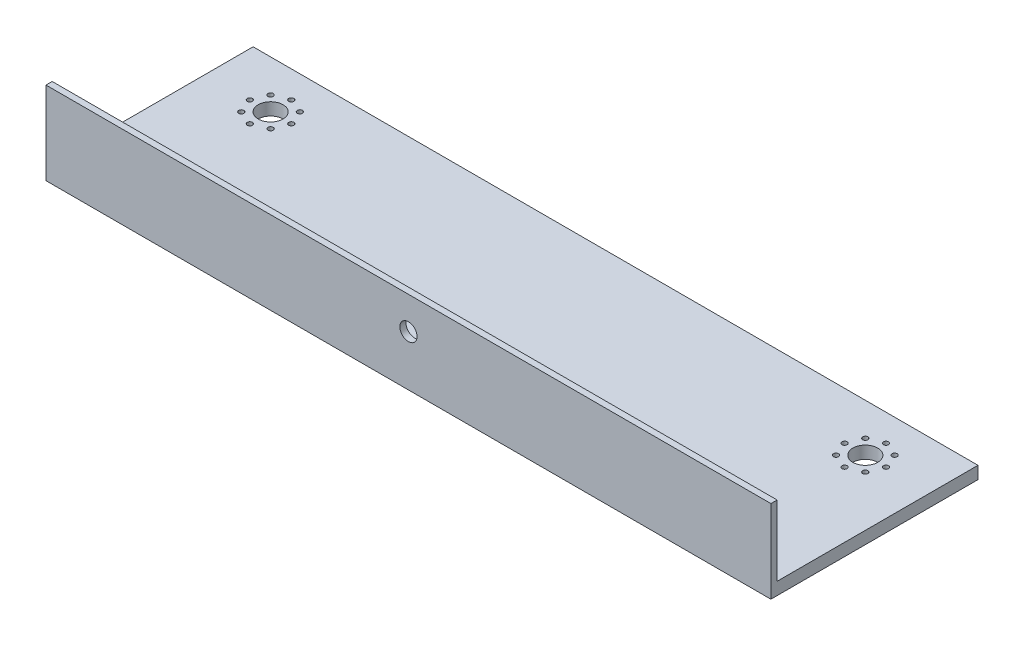
ISO-10303-21;
HEADER;
FILE_DESCRIPTION(('STEP AP214'),'2;1');
FILE_NAME('part.step','',(''),(''),'','','');
FILE_SCHEMA(('AUTOMOTIVE_DESIGN { 1 0 10303 214 1 1 1 1 }'));
ENDSEC;
DATA;
#1=APPLICATION_CONTEXT('core data for automotive mechanical design processes');
#2=APPLICATION_PROTOCOL_DEFINITION('international standard','automotive_design',2000,#1);
#3=PRODUCT_CONTEXT('',#1,'mechanical');
#4=PRODUCT('Part','Part','',(#3));
#5=PRODUCT_RELATED_PRODUCT_CATEGORY('part','',(#4));
#6=PRODUCT_DEFINITION_FORMATION('','',#4);
#7=PRODUCT_DEFINITION_CONTEXT('part definition',#1,'design');
#8=PRODUCT_DEFINITION('design','',#6,#7);
#9=PRODUCT_DEFINITION_SHAPE('','',#8);
#10=(LENGTH_UNIT() NAMED_UNIT(*) SI_UNIT(.MILLI.,.METRE.));
#11=(NAMED_UNIT(*) PLANE_ANGLE_UNIT() SI_UNIT($,.RADIAN.));
#12=(NAMED_UNIT(*) SI_UNIT($,.STERADIAN.) SOLID_ANGLE_UNIT());
#13=UNCERTAINTY_MEASURE_WITH_UNIT(LENGTH_MEASURE(1.E-05),#10,'distance_accuracy_value','');
#14=(GEOMETRIC_REPRESENTATION_CONTEXT(3) GLOBAL_UNCERTAINTY_ASSIGNED_CONTEXT((#13)) GLOBAL_UNIT_ASSIGNED_CONTEXT((#10,
#11,#12)) REPRESENTATION_CONTEXT('',''));
#15=CARTESIAN_POINT('',(0.,0.,0.));
#16=DIRECTION('',(0.,0.,1.));
#17=DIRECTION('',(1.,0.,0.));
#18=AXIS2_PLACEMENT_3D('',#15,#16,#17);
#19=CARTESIAN_POINT('',(0.,3.,0.));
#20=DIRECTION('',(0.,-1.,0.));
#21=DIRECTION('',(0.,0.,-1.));
#22=AXIS2_PLACEMENT_3D('',#19,#20,#21);
#23=PLANE('',#22);
#24=CARTESIAN_POINT('',(-143.57,3.,-37.0150274299857));
#25=DIRECTION('',(0.,-1.,0.));
#26=DIRECTION('',(0.,0.,1.));
#27=AXIS2_PLACEMENT_3D('',#24,#25,#26);
#28=CIRCLE('',#27,1.25000000000001);
#29=CARTESIAN_POINT('',(-143.57,3.,-35.7650274299857));
#30=VERTEX_POINT('',#29);
#31=EDGE_CURVE('E523',#30,#30,#28,.T.);
#32=ORIENTED_EDGE('',*,*,#31,.T.);
#33=EDGE_LOOP('',(#32));
#34=FACE_BOUND('',#33,.T.);
#35=CARTESIAN_POINT('',(-136.498932188135,3.,-19.9439596181202));
#36=DIRECTION('',(0.,-1.,0.));
#37=DIRECTION('',(0.,0.,-1.));
#38=AXIS2_PLACEMENT_3D('',#35,#36,#37);
#39=CIRCLE('',#38,1.25000000000001);
#40=CARTESIAN_POINT('',(-136.498932188135,3.,-21.1939596181202));
#41=VERTEX_POINT('',#40);
#42=EDGE_CURVE('E524',#41,#41,#39,.T.);
#43=ORIENTED_EDGE('',*,*,#42,.T.);
#44=EDGE_LOOP('',(#43));
#45=FACE_BOUND('',#44,.T.);
#46=CARTESIAN_POINT('',(-150.641067811865,3.,-19.9439596181202));
#47=DIRECTION('',(0.,-1.,0.));
#48=DIRECTION('',(0.,0.,1.));
#49=AXIS2_PLACEMENT_3D('',#46,#47,#48);
#50=CIRCLE('',#49,1.25000000000001);
#51=CARTESIAN_POINT('',(-150.641067811865,3.,-18.6939596181202));
#52=VERTEX_POINT('',#51);
#53=EDGE_CURVE('E530',#52,#52,#50,.T.);
#54=ORIENTED_EDGE('',*,*,#53,.T.);
#55=EDGE_LOOP('',(#54));
#56=FACE_BOUND('',#55,.T.);
#57=CARTESIAN_POINT('',(-150.641067811865,3.,-34.0860952418512));
#58=DIRECTION('',(0.,-1.,0.));
#59=DIRECTION('',(0.,0.,-1.));
#60=AXIS2_PLACEMENT_3D('',#57,#58,#59);
#61=CIRCLE('',#60,1.25000000000001);
#62=CARTESIAN_POINT('',(-150.641067811865,3.,-35.3360952418512));
#63=VERTEX_POINT('',#62);
#64=EDGE_CURVE('E536',#63,#63,#61,.T.);
#65=ORIENTED_EDGE('',*,*,#64,.T.);
#66=EDGE_LOOP('',(#65));
#67=FACE_BOUND('',#66,.T.);
#68=CARTESIAN_POINT('',(-136.498932188135,3.,-34.0860952418512));
#69=DIRECTION('',(0.,-1.,0.));
#70=DIRECTION('',(0.,0.,1.));
#71=AXIS2_PLACEMENT_3D('',#68,#69,#70);
#72=CIRCLE('',#71,1.25000000000001);
#73=CARTESIAN_POINT('',(-136.498932188135,3.,-32.8360952418512));
#74=VERTEX_POINT('',#73);
#75=EDGE_CURVE('E498',#74,#74,#72,.T.);
#76=ORIENTED_EDGE('',*,*,#75,.T.);
#77=EDGE_LOOP('',(#76));
#78=FACE_BOUND('',#77,.T.);
#79=CARTESIAN_POINT('',(-133.57,3.,-27.0150274299857));
#80=DIRECTION('',(0.,-1.,0.));
#81=DIRECTION('',(0.,0.,1.));
#82=AXIS2_PLACEMENT_3D('',#79,#80,#81);
#83=CIRCLE('',#82,1.25000000000001);
#84=CARTESIAN_POINT('',(-133.57,3.,-25.7650274299857));
#85=VERTEX_POINT('',#84);
#86=EDGE_CURVE('E505',#85,#85,#83,.T.);
#87=ORIENTED_EDGE('',*,*,#86,.T.);
#88=EDGE_LOOP('',(#87));
#89=FACE_BOUND('',#88,.T.);
#90=CARTESIAN_POINT('',(-143.57,3.,-17.0150274299857));
#91=DIRECTION('',(0.,-1.,0.));
#92=DIRECTION('',(0.,0.,1.));
#93=AXIS2_PLACEMENT_3D('',#90,#91,#92);
#94=CIRCLE('',#93,1.25000000000001);
#95=CARTESIAN_POINT('',(-143.57,3.,-15.7650274299857));
#96=VERTEX_POINT('',#95);
#97=EDGE_CURVE('E511',#96,#96,#94,.T.);
#98=ORIENTED_EDGE('',*,*,#97,.T.);
#99=EDGE_LOOP('',(#98));
#100=FACE_BOUND('',#99,.T.);
#101=CARTESIAN_POINT('',(-153.57,3.,-27.0150274299857));
#102=DIRECTION('',(0.,-1.,0.));
#103=DIRECTION('',(0.,0.,1.));
#104=AXIS2_PLACEMENT_3D('',#101,#102,#103);
#105=CIRCLE('',#104,1.25000000000001);
#106=CARTESIAN_POINT('',(-153.57,3.,-25.7650274299857));
#107=VERTEX_POINT('',#106);
#108=EDGE_CURVE('E517',#107,#107,#105,.T.);
#109=ORIENTED_EDGE('',*,*,#108,.T.);
#110=EDGE_LOOP('',(#109));
#111=FACE_BOUND('',#110,.T.);
#112=CARTESIAN_POINT('',(143.57,3.,-37.0150274299857));
#113=DIRECTION('',(0.,1.,0.));
#114=DIRECTION('',(0.,0.,1.));
#115=AXIS2_PLACEMENT_3D('',#112,#113,#114);
#116=CIRCLE('',#115,1.25000000000001);
#117=CARTESIAN_POINT('',(143.57,3.,-35.7650274299857));
#118=VERTEX_POINT('',#117);
#119=EDGE_CURVE('E450',#118,#118,#116,.T.);
#120=ORIENTED_EDGE('',*,*,#119,.F.);
#121=EDGE_LOOP('',(#120));
#122=FACE_BOUND('',#121,.T.);
#123=CARTESIAN_POINT('',(136.498932188135,3.,-19.9439596181202));
#124=DIRECTION('',(0.,1.,0.));
#125=DIRECTION('',(0.,0.,-1.));
#126=AXIS2_PLACEMENT_3D('',#123,#124,#125);
#127=CIRCLE('',#126,1.25000000000001);
#128=CARTESIAN_POINT('',(136.498932188135,3.,-21.1939596181202));
#129=VERTEX_POINT('',#128);
#130=EDGE_CURVE('E478',#129,#129,#127,.T.);
#131=ORIENTED_EDGE('',*,*,#130,.F.);
#132=EDGE_LOOP('',(#131));
#133=FACE_BOUND('',#132,.T.);
#134=CARTESIAN_POINT('',(150.641067811865,3.,-19.9439596181202));
#135=DIRECTION('',(0.,1.,0.));
#136=DIRECTION('',(0.,0.,1.));
#137=AXIS2_PLACEMENT_3D('',#134,#135,#136);
#138=CIRCLE('',#137,1.25000000000001);
#139=CARTESIAN_POINT('',(150.641067811865,3.,-18.6939596181202));
#140=VERTEX_POINT('',#139);
#141=EDGE_CURVE('E485',#140,#140,#138,.T.);
#142=ORIENTED_EDGE('',*,*,#141,.F.);
#143=EDGE_LOOP('',(#142));
#144=FACE_BOUND('',#143,.T.);
#145=CARTESIAN_POINT('',(150.641067811865,3.,-34.0860952418512));
#146=DIRECTION('',(0.,1.,0.));
#147=DIRECTION('',(0.,0.,-1.));
#148=AXIS2_PLACEMENT_3D('',#145,#146,#147);
#149=CIRCLE('',#148,1.25000000000001);
#150=CARTESIAN_POINT('',(150.641067811865,3.,-35.3360952418512));
#151=VERTEX_POINT('',#150);
#152=EDGE_CURVE('E491',#151,#151,#149,.T.);
#153=ORIENTED_EDGE('',*,*,#152,.F.);
#154=EDGE_LOOP('',(#153));
#155=FACE_BOUND('',#154,.T.);
#156=CARTESIAN_POINT('',(136.498932188135,3.,-34.0860952418512));
#157=DIRECTION('',(0.,1.,0.));
#158=DIRECTION('',(0.,0.,1.));
#159=AXIS2_PLACEMENT_3D('',#156,#157,#158);
#160=CIRCLE('',#159,1.25000000000001);
#161=CARTESIAN_POINT('',(136.498932188135,3.,-32.8360952418512));
#162=VERTEX_POINT('',#161);
#163=EDGE_CURVE('E453',#162,#162,#160,.T.);
#164=ORIENTED_EDGE('',*,*,#163,.F.);
#165=EDGE_LOOP('',(#164));
#166=FACE_BOUND('',#165,.T.);
#167=CARTESIAN_POINT('',(133.57,3.,-27.0150274299857));
#168=DIRECTION('',(0.,1.,0.));
#169=DIRECTION('',(0.,0.,1.));
#170=AXIS2_PLACEMENT_3D('',#167,#168,#169);
#171=CIRCLE('',#170,1.25000000000001);
#172=CARTESIAN_POINT('',(133.57,3.,-25.7650274299857));
#173=VERTEX_POINT('',#172);
#174=EDGE_CURVE('E460',#173,#173,#171,.T.);
#175=ORIENTED_EDGE('',*,*,#174,.F.);
#176=EDGE_LOOP('',(#175));
#177=FACE_BOUND('',#176,.T.);
#178=CARTESIAN_POINT('',(143.57,3.,-17.0150274299857));
#179=DIRECTION('',(0.,1.,0.));
#180=DIRECTION('',(0.,0.,1.));
#181=AXIS2_PLACEMENT_3D('',#178,#179,#180);
#182=CIRCLE('',#181,1.25000000000001);
#183=CARTESIAN_POINT('',(143.57,3.,-15.7650274299857));
#184=VERTEX_POINT('',#183);
#185=EDGE_CURVE('E466',#184,#184,#182,.T.);
#186=ORIENTED_EDGE('',*,*,#185,.F.);
#187=EDGE_LOOP('',(#186));
#188=FACE_BOUND('',#187,.T.);
#189=CARTESIAN_POINT('',(153.57,3.,-27.0150274299857));
#190=DIRECTION('',(0.,1.,0.));
#191=DIRECTION('',(0.,0.,1.));
#192=AXIS2_PLACEMENT_3D('',#189,#190,#191);
#193=CIRCLE('',#192,1.25000000000001);
#194=CARTESIAN_POINT('',(153.57,3.,-25.7650274299857));
#195=VERTEX_POINT('',#194);
#196=EDGE_CURVE('E472',#195,#195,#193,.T.);
#197=ORIENTED_EDGE('',*,*,#196,.F.);
#198=EDGE_LOOP('',(#197));
#199=FACE_BOUND('',#198,.T.);
#200=CARTESIAN_POINT('',(-143.57,3.,-27.0150274299857));
#201=DIRECTION('',(0.,1.,0.));
#202=DIRECTION('',(0.,0.,1.));
#203=AXIS2_PLACEMENT_3D('',#200,#201,#202);
#204=CIRCLE('',#203,6.00000000000002);
#205=CARTESIAN_POINT('',(-143.57,3.,-21.0150274299857));
#206=VERTEX_POINT('',#205);
#207=EDGE_CURVE('E120',#206,#206,#204,.T.);
#208=ORIENTED_EDGE('',*,*,#207,.F.);
#209=EDGE_LOOP('',(#208));
#210=FACE_BOUND('',#209,.T.);
#211=CARTESIAN_POINT('',(143.57,3.,-27.0150274299857));
#212=DIRECTION('',(0.,1.,0.));
#213=DIRECTION('',(0.,0.,1.));
#214=AXIS2_PLACEMENT_3D('',#211,#212,#213);
#215=CIRCLE('',#214,6.00000000000002);
#216=CARTESIAN_POINT('',(143.57,3.,-21.0150274299857));
#217=VERTEX_POINT('',#216);
#218=EDGE_CURVE('E126',#217,#217,#215,.T.);
#219=ORIENTED_EDGE('',*,*,#218,.F.);
#220=EDGE_LOOP('',(#219));
#221=FACE_BOUND('',#220,.T.);
#222=DIRECTION('',(-1.,0.,0.));
#223=VECTOR('',#222,1.);
#224=CARTESIAN_POINT('',(0.,3.,47.));
#225=LINE('',#224,#223);
#226=CARTESIAN_POINT('',(175.,3.,47.));
#227=VERTEX_POINT('',#226);
#228=CARTESIAN_POINT('',(-175.,3.,47.));
#229=VERTEX_POINT('',#228);
#230=EDGE_CURVE('E53',#227,#229,#225,.T.);
#231=ORIENTED_EDGE('',*,*,#230,.F.);
#232=DIRECTION('',(0.,0.,-1.));
#233=VECTOR('',#232,1.);
#234=CARTESIAN_POINT('',(175.,3.,50.));
#235=LINE('',#234,#233);
#236=CARTESIAN_POINT('',(175.,3.,-50.));
#237=VERTEX_POINT('',#236);
#238=EDGE_CURVE('E95',#227,#237,#235,.T.);
#239=ORIENTED_EDGE('',*,*,#238,.T.);
#240=DIRECTION('',(-1.,0.,0.));
#241=VECTOR('',#240,1.);
#242=CARTESIAN_POINT('',(-175.,3.,-50.));
#243=LINE('',#242,#241);
#244=CARTESIAN_POINT('',(-175.,3.,-50.));
#245=VERTEX_POINT('',#244);
#246=EDGE_CURVE('E133',#237,#245,#243,.T.);
#247=ORIENTED_EDGE('',*,*,#246,.T.);
#248=DIRECTION('',(0.,0.,1.));
#249=VECTOR('',#248,1.);
#250=CARTESIAN_POINT('',(-175.,3.,50.));
#251=LINE('',#250,#249);
#252=EDGE_CURVE('E58',#245,#229,#251,.T.);
#253=ORIENTED_EDGE('',*,*,#252,.T.);
#254=EDGE_LOOP('',(#231,#239,#247,#253));
#255=FACE_BOUND('',#254,.T.);
#256=ADVANCED_FACE('F37',(#34,#45,#56,#67,#78,#89,#100,#111,#122,#133,#144,#155,#166,#177,#188,
#199,#210,#221,#255),#23,.F.);
#257=CARTESIAN_POINT('',(0.,-3.,0.));
#258=DIRECTION('',(0.,-1.,0.));
#259=DIRECTION('',(0.,0.,-1.));
#260=AXIS2_PLACEMENT_3D('',#257,#258,#259);
#261=PLANE('',#260);
#262=CARTESIAN_POINT('',(-143.57,-3.,-37.0150274299857));
#263=DIRECTION('',(0.,-1.,0.));
#264=DIRECTION('',(0.,0.,1.));
#265=AXIS2_PLACEMENT_3D('',#262,#263,#264);
#266=CIRCLE('',#265,1.25000000000001);
#267=CARTESIAN_POINT('',(-143.57,-3.,-35.7650274299857));
#268=VERTEX_POINT('',#267);
#269=EDGE_CURVE('E482',#268,#268,#266,.T.);
#270=ORIENTED_EDGE('',*,*,#269,.F.);
#271=EDGE_LOOP('',(#270));
#272=FACE_BOUND('',#271,.T.);
#273=CARTESIAN_POINT('',(-136.498932188135,-3.,-19.9439596181202));
#274=DIRECTION('',(0.,-1.,0.));
#275=DIRECTION('',(0.,0.,-1.));
#276=AXIS2_PLACEMENT_3D('',#273,#274,#275);
#277=CIRCLE('',#276,1.25000000000001);
#278=CARTESIAN_POINT('',(-136.498932188135,-3.,-21.1939596181202));
#279=VERTEX_POINT('',#278);
#280=EDGE_CURVE('E527',#279,#279,#277,.T.);
#281=ORIENTED_EDGE('',*,*,#280,.F.);
#282=EDGE_LOOP('',(#281));
#283=FACE_BOUND('',#282,.T.);
#284=CARTESIAN_POINT('',(-150.641067811865,-3.,-19.9439596181202));
#285=DIRECTION('',(0.,-1.,0.));
#286=DIRECTION('',(0.,0.,1.));
#287=AXIS2_PLACEMENT_3D('',#284,#285,#286);
#288=CIRCLE('',#287,1.25000000000001);
#289=CARTESIAN_POINT('',(-150.641067811865,-3.,-18.6939596181202));
#290=VERTEX_POINT('',#289);
#291=EDGE_CURVE('E533',#290,#290,#288,.T.);
#292=ORIENTED_EDGE('',*,*,#291,.F.);
#293=EDGE_LOOP('',(#292));
#294=FACE_BOUND('',#293,.T.);
#295=CARTESIAN_POINT('',(-150.641067811865,-3.,-34.0860952418512));
#296=DIRECTION('',(0.,-1.,0.));
#297=DIRECTION('',(0.,0.,-1.));
#298=AXIS2_PLACEMENT_3D('',#295,#296,#297);
#299=CIRCLE('',#298,1.25000000000001);
#300=CARTESIAN_POINT('',(-150.641067811865,-3.,-35.3360952418512));
#301=VERTEX_POINT('',#300);
#302=EDGE_CURVE('E502',#301,#301,#299,.T.);
#303=ORIENTED_EDGE('',*,*,#302,.F.);
#304=EDGE_LOOP('',(#303));
#305=FACE_BOUND('',#304,.T.);
#306=CARTESIAN_POINT('',(-136.498932188135,-3.,-34.0860952418512));
#307=DIRECTION('',(0.,-1.,0.));
#308=DIRECTION('',(0.,0.,1.));
#309=AXIS2_PLACEMENT_3D('',#306,#307,#308);
#310=CIRCLE('',#309,1.25000000000001);
#311=CARTESIAN_POINT('',(-136.498932188135,-3.,-32.8360952418512));
#312=VERTEX_POINT('',#311);
#313=EDGE_CURVE('E501',#312,#312,#310,.T.);
#314=ORIENTED_EDGE('',*,*,#313,.F.);
#315=EDGE_LOOP('',(#314));
#316=FACE_BOUND('',#315,.T.);
#317=CARTESIAN_POINT('',(-133.57,-3.,-27.0150274299857));
#318=DIRECTION('',(0.,-1.,0.));
#319=DIRECTION('',(0.,0.,1.));
#320=AXIS2_PLACEMENT_3D('',#317,#318,#319);
#321=CIRCLE('',#320,1.25000000000001);
#322=CARTESIAN_POINT('',(-133.57,-3.,-25.7650274299857));
#323=VERTEX_POINT('',#322);
#324=EDGE_CURVE('E508',#323,#323,#321,.T.);
#325=ORIENTED_EDGE('',*,*,#324,.F.);
#326=EDGE_LOOP('',(#325));
#327=FACE_BOUND('',#326,.T.);
#328=CARTESIAN_POINT('',(-143.57,-3.,-17.0150274299857));
#329=DIRECTION('',(0.,-1.,0.));
#330=DIRECTION('',(0.,0.,1.));
#331=AXIS2_PLACEMENT_3D('',#328,#329,#330);
#332=CIRCLE('',#331,1.25000000000001);
#333=CARTESIAN_POINT('',(-143.57,-3.,-15.7650274299857));
#334=VERTEX_POINT('',#333);
#335=EDGE_CURVE('E514',#334,#334,#332,.T.);
#336=ORIENTED_EDGE('',*,*,#335,.F.);
#337=EDGE_LOOP('',(#336));
#338=FACE_BOUND('',#337,.T.);
#339=CARTESIAN_POINT('',(-153.57,-3.,-27.0150274299857));
#340=DIRECTION('',(0.,-1.,0.));
#341=DIRECTION('',(0.,0.,1.));
#342=AXIS2_PLACEMENT_3D('',#339,#340,#341);
#343=CIRCLE('',#342,1.25000000000001);
#344=CARTESIAN_POINT('',(-153.57,-3.,-25.7650274299857));
#345=VERTEX_POINT('',#344);
#346=EDGE_CURVE('E520',#345,#345,#343,.T.);
#347=ORIENTED_EDGE('',*,*,#346,.F.);
#348=EDGE_LOOP('',(#347));
#349=FACE_BOUND('',#348,.T.);
#350=CARTESIAN_POINT('',(143.57,-3.,-37.0150274299857));
#351=DIRECTION('',(0.,1.,0.));
#352=DIRECTION('',(0.,0.,1.));
#353=AXIS2_PLACEMENT_3D('',#350,#351,#352);
#354=CIRCLE('',#353,1.25000000000001);
#355=CARTESIAN_POINT('',(143.57,-3.,-35.7650274299857));
#356=VERTEX_POINT('',#355);
#357=EDGE_CURVE('E447',#356,#356,#354,.T.);
#358=ORIENTED_EDGE('',*,*,#357,.T.);
#359=EDGE_LOOP('',(#358));
#360=FACE_BOUND('',#359,.T.);
#361=CARTESIAN_POINT('',(136.498932188135,-3.,-19.9439596181202));
#362=DIRECTION('',(0.,1.,0.));
#363=DIRECTION('',(0.,0.,-1.));
#364=AXIS2_PLACEMENT_3D('',#361,#362,#363);
#365=CIRCLE('',#364,1.25000000000001);
#366=CARTESIAN_POINT('',(136.498932188135,-3.,-21.1939596181202));
#367=VERTEX_POINT('',#366);
#368=EDGE_CURVE('E481',#367,#367,#365,.T.);
#369=ORIENTED_EDGE('',*,*,#368,.T.);
#370=EDGE_LOOP('',(#369));
#371=FACE_BOUND('',#370,.T.);
#372=CARTESIAN_POINT('',(150.641067811865,-3.,-19.9439596181202));
#373=DIRECTION('',(0.,1.,0.));
#374=DIRECTION('',(0.,0.,1.));
#375=AXIS2_PLACEMENT_3D('',#372,#373,#374);
#376=CIRCLE('',#375,1.25000000000001);
#377=CARTESIAN_POINT('',(150.641067811865,-3.,-18.6939596181202));
#378=VERTEX_POINT('',#377);
#379=EDGE_CURVE('E488',#378,#378,#376,.T.);
#380=ORIENTED_EDGE('',*,*,#379,.T.);
#381=EDGE_LOOP('',(#380));
#382=FACE_BOUND('',#381,.T.);
#383=CARTESIAN_POINT('',(150.641067811865,-3.,-34.0860952418512));
#384=DIRECTION('',(0.,1.,0.));
#385=DIRECTION('',(0.,0.,-1.));
#386=AXIS2_PLACEMENT_3D('',#383,#384,#385);
#387=CIRCLE('',#386,1.25000000000001);
#388=CARTESIAN_POINT('',(150.641067811865,-3.,-35.3360952418512));
#389=VERTEX_POINT('',#388);
#390=EDGE_CURVE('E457',#389,#389,#387,.T.);
#391=ORIENTED_EDGE('',*,*,#390,.T.);
#392=EDGE_LOOP('',(#391));
#393=FACE_BOUND('',#392,.T.);
#394=CARTESIAN_POINT('',(136.498932188135,-3.,-34.0860952418512));
#395=DIRECTION('',(0.,1.,0.));
#396=DIRECTION('',(0.,0.,1.));
#397=AXIS2_PLACEMENT_3D('',#394,#395,#396);
#398=CIRCLE('',#397,1.25000000000001);
#399=CARTESIAN_POINT('',(136.498932188135,-3.,-32.8360952418512));
#400=VERTEX_POINT('',#399);
#401=EDGE_CURVE('E456',#400,#400,#398,.T.);
#402=ORIENTED_EDGE('',*,*,#401,.T.);
#403=EDGE_LOOP('',(#402));
#404=FACE_BOUND('',#403,.T.);
#405=CARTESIAN_POINT('',(133.57,-3.,-27.0150274299857));
#406=DIRECTION('',(0.,1.,0.));
#407=DIRECTION('',(0.,0.,1.));
#408=AXIS2_PLACEMENT_3D('',#405,#406,#407);
#409=CIRCLE('',#408,1.25000000000001);
#410=CARTESIAN_POINT('',(133.57,-3.,-25.7650274299857));
#411=VERTEX_POINT('',#410);
#412=EDGE_CURVE('E463',#411,#411,#409,.T.);
#413=ORIENTED_EDGE('',*,*,#412,.T.);
#414=EDGE_LOOP('',(#413));
#415=FACE_BOUND('',#414,.T.);
#416=CARTESIAN_POINT('',(143.57,-3.,-17.0150274299857));
#417=DIRECTION('',(0.,1.,0.));
#418=DIRECTION('',(0.,0.,1.));
#419=AXIS2_PLACEMENT_3D('',#416,#417,#418);
#420=CIRCLE('',#419,1.25000000000001);
#421=CARTESIAN_POINT('',(143.57,-3.,-15.7650274299857));
#422=VERTEX_POINT('',#421);
#423=EDGE_CURVE('E469',#422,#422,#420,.T.);
#424=ORIENTED_EDGE('',*,*,#423,.T.);
#425=EDGE_LOOP('',(#424));
#426=FACE_BOUND('',#425,.T.);
#427=CARTESIAN_POINT('',(153.57,-3.,-27.0150274299857));
#428=DIRECTION('',(0.,1.,0.));
#429=DIRECTION('',(0.,0.,1.));
#430=AXIS2_PLACEMENT_3D('',#427,#428,#429);
#431=CIRCLE('',#430,1.25000000000001);
#432=CARTESIAN_POINT('',(153.57,-3.,-25.7650274299857));
#433=VERTEX_POINT('',#432);
#434=EDGE_CURVE('E475',#433,#433,#431,.T.);
#435=ORIENTED_EDGE('',*,*,#434,.T.);
#436=EDGE_LOOP('',(#435));
#437=FACE_BOUND('',#436,.T.);
#438=DIRECTION('',(1.,0.,0.));
#439=VECTOR('',#438,1.);
#440=CARTESIAN_POINT('',(-175.,-3.,50.));
#441=LINE('',#440,#439);
#442=CARTESIAN_POINT('',(-175.,-3.,50.));
#443=VERTEX_POINT('',#442);
#444=CARTESIAN_POINT('',(175.,-3.,50.));
#445=VERTEX_POINT('',#444);
#446=EDGE_CURVE('E134',#443,#445,#441,.T.);
#447=ORIENTED_EDGE('',*,*,#446,.F.);
#448=DIRECTION('',(0.,0.,1.));
#449=VECTOR('',#448,1.);
#450=CARTESIAN_POINT('',(-175.,-3.,50.));
#451=LINE('',#450,#449);
#452=CARTESIAN_POINT('',(-175.,-3.,-50.));
#453=VERTEX_POINT('',#452);
#454=EDGE_CURVE('E141',#453,#443,#451,.T.);
#455=ORIENTED_EDGE('',*,*,#454,.F.);
#456=DIRECTION('',(-1.,0.,0.));
#457=VECTOR('',#456,1.);
#458=CARTESIAN_POINT('',(-175.,-3.,-50.));
#459=LINE('',#458,#457);
#460=CARTESIAN_POINT('',(175.,-3.,-50.));
#461=VERTEX_POINT('',#460);
#462=EDGE_CURVE('E139',#461,#453,#459,.T.);
#463=ORIENTED_EDGE('',*,*,#462,.F.);
#464=DIRECTION('',(0.,0.,-1.));
#465=VECTOR('',#464,1.);
#466=CARTESIAN_POINT('',(175.,-3.,50.));
#467=LINE('',#466,#465);
#468=EDGE_CURVE('E129',#445,#461,#467,.T.);
#469=ORIENTED_EDGE('',*,*,#468,.F.);
#470=EDGE_LOOP('',(#447,#455,#463,#469));
#471=FACE_BOUND('',#470,.T.);
#472=CARTESIAN_POINT('',(143.57,-3.,-27.0150274299857));
#473=DIRECTION('',(0.,1.,0.));
#474=DIRECTION('',(0.,0.,1.));
#475=AXIS2_PLACEMENT_3D('',#472,#473,#474);
#476=CIRCLE('',#475,6.00000000000002);
#477=CARTESIAN_POINT('',(143.57,-3.,-21.0150274299857));
#478=VERTEX_POINT('',#477);
#479=EDGE_CURVE('E123',#478,#478,#476,.T.);
#480=ORIENTED_EDGE('',*,*,#479,.T.);
#481=EDGE_LOOP('',(#480));
#482=FACE_BOUND('',#481,.T.);
#483=CARTESIAN_POINT('',(-143.57,-3.,-27.0150274299857));
#484=DIRECTION('',(0.,1.,0.));
#485=DIRECTION('',(0.,0.,1.));
#486=AXIS2_PLACEMENT_3D('',#483,#484,#485);
#487=CIRCLE('',#486,6.00000000000002);
#488=CARTESIAN_POINT('',(-143.57,-3.,-21.0150274299857));
#489=VERTEX_POINT('',#488);
#490=EDGE_CURVE('E119',#489,#489,#487,.T.);
#491=ORIENTED_EDGE('',*,*,#490,.T.);
#492=EDGE_LOOP('',(#491));
#493=FACE_BOUND('',#492,.T.);
#494=ADVANCED_FACE('F158',(#272,#283,#294,#305,#316,#327,#338,#349,#360,#371,#382,#393,#404,
#415,#426,#437,#471,#482,#493),#261,.T.);
#495=CARTESIAN_POINT('',(175.,3.,50.));
#496=DIRECTION('',(-1.,0.,0.));
#497=DIRECTION('',(0.,0.,1.));
#498=AXIS2_PLACEMENT_3D('',#495,#496,#497);
#499=PLANE('',#498);
#500=ORIENTED_EDGE('',*,*,#468,.T.);
#501=DIRECTION('',(0.,-1.,0.));
#502=VECTOR('',#501,1.);
#503=CARTESIAN_POINT('',(175.,3.,-50.));
#504=LINE('',#503,#502);
#505=EDGE_CURVE('E11',#237,#461,#504,.T.);
#506=ORIENTED_EDGE('',*,*,#505,.F.);
#507=ORIENTED_EDGE('',*,*,#238,.F.);
#508=DIRECTION('',(0.,1.,0.));
#509=VECTOR('',#508,1.);
#510=CARTESIAN_POINT('',(175.,-3.,47.));
#511=LINE('',#510,#509);
#512=CARTESIAN_POINT('',(175.,37.,47.));
#513=VERTEX_POINT('',#512);
#514=EDGE_CURVE('E89',#227,#513,#511,.T.);
#515=ORIENTED_EDGE('',*,*,#514,.T.);
#516=DIRECTION('',(0.,0.,1.));
#517=VECTOR('',#516,1.);
#518=CARTESIAN_POINT('',(175.,37.,47.));
#519=LINE('',#518,#517);
#520=CARTESIAN_POINT('',(175.,37.,50.));
#521=VERTEX_POINT('',#520);
#522=EDGE_CURVE('E92',#513,#521,#519,.T.);
#523=ORIENTED_EDGE('',*,*,#522,.T.);
#524=DIRECTION('',(0.,-1.,0.));
#525=VECTOR('',#524,1.);
#526=CARTESIAN_POINT('',(175.,3.,50.));
#527=LINE('',#526,#525);
#528=EDGE_CURVE('E137',#521,#445,#527,.T.);
#529=ORIENTED_EDGE('',*,*,#528,.T.);
#530=EDGE_LOOP('',(#500,#506,#507,#515,#523,#529));
#531=FACE_BOUND('',#530,.T.);
#532=ADVANCED_FACE('F39',(#531),#499,.F.);
#533=CARTESIAN_POINT('',(-175.,3.,-50.));
#534=DIRECTION('',(0.,0.,1.));
#535=DIRECTION('',(1.,0.,0.));
#536=AXIS2_PLACEMENT_3D('',#533,#534,#535);
#537=PLANE('',#536);
#538=ORIENTED_EDGE('',*,*,#462,.T.);
#539=DIRECTION('',(0.,-1.,0.));
#540=VECTOR('',#539,1.);
#541=CARTESIAN_POINT('',(-175.,3.,-50.));
#542=LINE('',#541,#540);
#543=EDGE_CURVE('E46',#245,#453,#542,.T.);
#544=ORIENTED_EDGE('',*,*,#543,.F.);
#545=ORIENTED_EDGE('',*,*,#246,.F.);
#546=ORIENTED_EDGE('',*,*,#505,.T.);
#547=EDGE_LOOP('',(#538,#544,#545,#546));
#548=FACE_BOUND('',#547,.T.);
#549=ADVANCED_FACE('F163',(#548),#537,.F.);
#550=CARTESIAN_POINT('',(-175.,3.,50.));
#551=DIRECTION('',(1.,0.,0.));
#552=DIRECTION('',(0.,0.,-1.));
#553=AXIS2_PLACEMENT_3D('',#550,#551,#552);
#554=PLANE('',#553);
#555=DIRECTION('',(0.,-1.,0.));
#556=VECTOR('',#555,1.);
#557=CARTESIAN_POINT('',(-175.,3.,50.));
#558=LINE('',#557,#556);
#559=CARTESIAN_POINT('',(-175.,37.,50.));
#560=VERTEX_POINT('',#559);
#561=EDGE_CURVE('E145',#560,#443,#558,.T.);
#562=ORIENTED_EDGE('',*,*,#561,.F.);
#563=DIRECTION('',(0.,0.,1.));
#564=VECTOR('',#563,1.);
#565=CARTESIAN_POINT('',(-175.,37.,47.));
#566=LINE('',#565,#564);
#567=CARTESIAN_POINT('',(-175.,37.,47.));
#568=VERTEX_POINT('',#567);
#569=EDGE_CURVE('E106',#568,#560,#566,.T.);
#570=ORIENTED_EDGE('',*,*,#569,.F.);
#571=DIRECTION('',(0.,1.,0.));
#572=VECTOR('',#571,1.);
#573=CARTESIAN_POINT('',(-175.,-3.,47.));
#574=LINE('',#573,#572);
#575=EDGE_CURVE('E107',#229,#568,#574,.T.);
#576=ORIENTED_EDGE('',*,*,#575,.F.);
#577=ORIENTED_EDGE('',*,*,#252,.F.);
#578=ORIENTED_EDGE('',*,*,#543,.T.);
#579=ORIENTED_EDGE('',*,*,#454,.T.);
#580=EDGE_LOOP('',(#562,#570,#576,#577,#578,#579));
#581=FACE_BOUND('',#580,.T.);
#582=ADVANCED_FACE('F152',(#581),#554,.F.);
#583=CARTESIAN_POINT('',(-175.,3.,50.));
#584=DIRECTION('',(0.,0.,-1.));
#585=DIRECTION('',(-1.,0.,0.));
#586=AXIS2_PLACEMENT_3D('',#583,#584,#585);
#587=PLANE('',#586);
#588=CARTESIAN_POINT('',(0.,21.3696464367826,50.));
#589=DIRECTION('',(0.,0.,1.));
#590=DIRECTION('',(1.,0.,0.));
#591=AXIS2_PLACEMENT_3D('',#588,#589,#590);
#592=CIRCLE('',#591,4.15);
#593=CARTESIAN_POINT('',(4.14999999999997,21.3696464367826,50.));
#594=VERTEX_POINT('',#593);
#595=EDGE_CURVE('E445',#594,#594,#592,.T.);
#596=ORIENTED_EDGE('',*,*,#595,.F.);
#597=EDGE_LOOP('',(#596));
#598=FACE_BOUND('',#597,.T.);
#599=ORIENTED_EDGE('',*,*,#446,.T.);
#600=ORIENTED_EDGE('',*,*,#528,.F.);
#601=DIRECTION('',(-1.,0.,0.));
#602=VECTOR('',#601,1.);
#603=CARTESIAN_POINT('',(175.,37.,50.));
#604=LINE('',#603,#602);
#605=EDGE_CURVE('E99',#521,#560,#604,.T.);
#606=ORIENTED_EDGE('',*,*,#605,.T.);
#607=ORIENTED_EDGE('',*,*,#561,.T.);
#608=EDGE_LOOP('',(#599,#600,#606,#607));
#609=FACE_BOUND('',#608,.T.);
#610=ADVANCED_FACE('F162',(#598,#609),#587,.F.);
#611=CARTESIAN_POINT('',(143.57,3.,-27.0150274299857));
#612=DIRECTION('',(0.,-1.,0.));
#613=DIRECTION('',(0.,0.,-1.));
#614=AXIS2_PLACEMENT_3D('',#611,#612,#613);
#615=CYLINDRICAL_SURFACE('',#614,6.00000000000002);
#616=ORIENTED_EDGE('',*,*,#218,.T.);
#617=EDGE_LOOP('',(#616));
#618=FACE_BOUND('',#617,.T.);
#619=ORIENTED_EDGE('',*,*,#479,.F.);
#620=EDGE_LOOP('',(#619));
#621=FACE_BOUND('',#620,.T.);
#622=ADVANCED_FACE('F175',(#618,#621),#615,.F.);
#623=CARTESIAN_POINT('',(-143.57,3.,-27.0150274299857));
#624=DIRECTION('',(0.,-1.,0.));
#625=DIRECTION('',(0.,0.,-1.));
#626=AXIS2_PLACEMENT_3D('',#623,#624,#625);
#627=CYLINDRICAL_SURFACE('',#626,6.00000000000002);
#628=ORIENTED_EDGE('',*,*,#207,.T.);
#629=EDGE_LOOP('',(#628));
#630=FACE_BOUND('',#629,.T.);
#631=ORIENTED_EDGE('',*,*,#490,.F.);
#632=EDGE_LOOP('',(#631));
#633=FACE_BOUND('',#632,.T.);
#634=ADVANCED_FACE('F324',(#630,#633),#627,.F.);
#635=CARTESIAN_POINT('',(0.,0.,47.));
#636=DIRECTION('',(0.,0.,1.));
#637=DIRECTION('',(1.,0.,0.));
#638=AXIS2_PLACEMENT_3D('',#635,#636,#637);
#639=PLANE('',#638);
#640=CARTESIAN_POINT('',(0.,21.3696464367826,47.));
#641=DIRECTION('',(0.,0.,1.));
#642=DIRECTION('',(1.,0.,0.));
#643=AXIS2_PLACEMENT_3D('',#640,#641,#642);
#644=CIRCLE('',#643,4.15);
#645=CARTESIAN_POINT('',(4.14999999999997,21.3696464367826,47.));
#646=VERTEX_POINT('',#645);
#647=EDGE_CURVE('E41',#646,#646,#644,.T.);
#648=ORIENTED_EDGE('',*,*,#647,.T.);
#649=EDGE_LOOP('',(#648));
#650=FACE_BOUND('',#649,.T.);
#651=ORIENTED_EDGE('',*,*,#514,.F.);
#652=ORIENTED_EDGE('',*,*,#230,.T.);
#653=ORIENTED_EDGE('',*,*,#575,.T.);
#654=DIRECTION('',(-1.,0.,0.));
#655=VECTOR('',#654,1.);
#656=CARTESIAN_POINT('',(175.,37.,47.));
#657=LINE('',#656,#655);
#658=EDGE_CURVE('E98',#513,#568,#657,.T.);
#659=ORIENTED_EDGE('',*,*,#658,.F.);
#660=EDGE_LOOP('',(#651,#652,#653,#659));
#661=FACE_BOUND('',#660,.T.);
#662=ADVANCED_FACE('F109',(#650,#661),#639,.F.);
#663=CARTESIAN_POINT('',(175.,37.,47.));
#664=DIRECTION('',(0.,1.,0.));
#665=DIRECTION('',(-1.,0.,0.));
#666=AXIS2_PLACEMENT_3D('',#663,#664,#665);
#667=PLANE('',#666);
#668=ORIENTED_EDGE('',*,*,#605,.F.);
#669=ORIENTED_EDGE('',*,*,#522,.F.);
#670=ORIENTED_EDGE('',*,*,#658,.T.);
#671=ORIENTED_EDGE('',*,*,#569,.T.);
#672=EDGE_LOOP('',(#668,#669,#670,#671));
#673=FACE_BOUND('',#672,.T.);
#674=ADVANCED_FACE('F103',(#673),#667,.T.);
#675=CARTESIAN_POINT('',(0.,21.3696464367826,-50.));
#676=DIRECTION('',(0.,0.,1.));
#677=DIRECTION('',(1.,0.,0.));
#678=AXIS2_PLACEMENT_3D('',#675,#676,#677);
#679=CYLINDRICAL_SURFACE('',#678,4.15);
#680=ORIENTED_EDGE('',*,*,#595,.T.);
#681=EDGE_LOOP('',(#680));
#682=FACE_BOUND('',#681,.T.);
#683=ORIENTED_EDGE('',*,*,#647,.F.);
#684=EDGE_LOOP('',(#683));
#685=FACE_BOUND('',#684,.T.);
#686=ADVANCED_FACE('F307',(#682,#685),#679,.F.);
#687=CARTESIAN_POINT('',(153.57,-3.,-27.0150274299857));
#688=DIRECTION('',(0.,1.,0.));
#689=DIRECTION('',(0.,0.,1.));
#690=AXIS2_PLACEMENT_3D('',#687,#688,#689);
#691=CYLINDRICAL_SURFACE('',#690,1.25000000000001);
#692=ORIENTED_EDGE('',*,*,#434,.F.);
#693=EDGE_LOOP('',(#692));
#694=FACE_BOUND('',#693,.T.);
#695=ORIENTED_EDGE('',*,*,#196,.T.);
#696=EDGE_LOOP('',(#695));
#697=FACE_BOUND('',#696,.T.);
#698=ADVANCED_FACE('F303',(#694,#697),#691,.F.);
#699=CARTESIAN_POINT('',(143.57,-3.,-17.0150274299857));
#700=DIRECTION('',(0.,1.,0.));
#701=DIRECTION('',(0.,0.,1.));
#702=AXIS2_PLACEMENT_3D('',#699,#700,#701);
#703=CYLINDRICAL_SURFACE('',#702,1.25000000000001);
#704=ORIENTED_EDGE('',*,*,#423,.F.);
#705=EDGE_LOOP('',(#704));
#706=FACE_BOUND('',#705,.T.);
#707=ORIENTED_EDGE('',*,*,#185,.T.);
#708=EDGE_LOOP('',(#707));
#709=FACE_BOUND('',#708,.T.);
#710=ADVANCED_FACE('F306',(#706,#709),#703,.F.);
#711=CARTESIAN_POINT('',(133.57,-3.,-27.0150274299857));
#712=DIRECTION('',(0.,1.,0.));
#713=DIRECTION('',(0.,0.,1.));
#714=AXIS2_PLACEMENT_3D('',#711,#712,#713);
#715=CYLINDRICAL_SURFACE('',#714,1.25000000000001);
#716=ORIENTED_EDGE('',*,*,#412,.F.);
#717=EDGE_LOOP('',(#716));
#718=FACE_BOUND('',#717,.T.);
#719=ORIENTED_EDGE('',*,*,#174,.T.);
#720=EDGE_LOOP('',(#719));
#721=FACE_BOUND('',#720,.T.);
#722=ADVANCED_FACE('F311',(#718,#721),#715,.F.);
#723=CARTESIAN_POINT('',(136.498932188135,-3.,-34.0860952418512));
#724=DIRECTION('',(0.,1.,0.));
#725=DIRECTION('',(0.,0.,1.));
#726=AXIS2_PLACEMENT_3D('',#723,#724,#725);
#727=CYLINDRICAL_SURFACE('',#726,1.25000000000001);
#728=ORIENTED_EDGE('',*,*,#401,.F.);
#729=EDGE_LOOP('',(#728));
#730=FACE_BOUND('',#729,.T.);
#731=ORIENTED_EDGE('',*,*,#163,.T.);
#732=EDGE_LOOP('',(#731));
#733=FACE_BOUND('',#732,.T.);
#734=ADVANCED_FACE('F295',(#730,#733),#727,.F.);
#735=CARTESIAN_POINT('',(150.641067811865,-3.,-34.0860952418512));
#736=DIRECTION('',(0.,1.,0.));
#737=DIRECTION('',(0.,0.,1.));
#738=AXIS2_PLACEMENT_3D('',#735,#736,#737);
#739=CYLINDRICAL_SURFACE('',#738,1.25000000000001);
#740=ORIENTED_EDGE('',*,*,#390,.F.);
#741=EDGE_LOOP('',(#740));
#742=FACE_BOUND('',#741,.T.);
#743=ORIENTED_EDGE('',*,*,#152,.T.);
#744=EDGE_LOOP('',(#743));
#745=FACE_BOUND('',#744,.T.);
#746=ADVANCED_FACE('F291',(#742,#745),#739,.F.);
#747=CARTESIAN_POINT('',(150.641067811865,-3.,-19.9439596181202));
#748=DIRECTION('',(0.,1.,0.));
#749=DIRECTION('',(0.,0.,1.));
#750=AXIS2_PLACEMENT_3D('',#747,#748,#749);
#751=CYLINDRICAL_SURFACE('',#750,1.25000000000001);
#752=ORIENTED_EDGE('',*,*,#379,.F.);
#753=EDGE_LOOP('',(#752));
#754=FACE_BOUND('',#753,.T.);
#755=ORIENTED_EDGE('',*,*,#141,.T.);
#756=EDGE_LOOP('',(#755));
#757=FACE_BOUND('',#756,.T.);
#758=ADVANCED_FACE('F294',(#754,#757),#751,.F.);
#759=CARTESIAN_POINT('',(136.498932188135,-3.,-19.9439596181202));
#760=DIRECTION('',(0.,1.,0.));
#761=DIRECTION('',(0.,0.,1.));
#762=AXIS2_PLACEMENT_3D('',#759,#760,#761);
#763=CYLINDRICAL_SURFACE('',#762,1.25000000000001);
#764=ORIENTED_EDGE('',*,*,#368,.F.);
#765=EDGE_LOOP('',(#764));
#766=FACE_BOUND('',#765,.T.);
#767=ORIENTED_EDGE('',*,*,#130,.T.);
#768=EDGE_LOOP('',(#767));
#769=FACE_BOUND('',#768,.T.);
#770=ADVANCED_FACE('F289',(#766,#769),#763,.F.);
#771=CARTESIAN_POINT('',(143.57,-3.,-37.0150274299857));
#772=DIRECTION('',(0.,1.,0.));
#773=DIRECTION('',(0.,0.,1.));
#774=AXIS2_PLACEMENT_3D('',#771,#772,#773);
#775=CYLINDRICAL_SURFACE('',#774,1.25000000000001);
#776=ORIENTED_EDGE('',*,*,#357,.F.);
#777=EDGE_LOOP('',(#776));
#778=FACE_BOUND('',#777,.T.);
#779=ORIENTED_EDGE('',*,*,#119,.T.);
#780=EDGE_LOOP('',(#779));
#781=FACE_BOUND('',#780,.T.);
#782=ADVANCED_FACE('F209',(#778,#781),#775,.F.);
#783=CARTESIAN_POINT('',(-153.57,-3.,-27.0150274299857));
#784=DIRECTION('',(0.,1.,0.));
#785=DIRECTION('',(0.,0.,1.));
#786=AXIS2_PLACEMENT_3D('',#783,#784,#785);
#787=CYLINDRICAL_SURFACE('',#786,1.25000000000001);
#788=ORIENTED_EDGE('',*,*,#346,.T.);
#789=EDGE_LOOP('',(#788));
#790=FACE_BOUND('',#789,.T.);
#791=ORIENTED_EDGE('',*,*,#108,.F.);
#792=EDGE_LOOP('',(#791));
#793=FACE_BOUND('',#792,.T.);
#794=ADVANCED_FACE('F203',(#790,#793),#787,.F.);
#795=CARTESIAN_POINT('',(-143.57,-3.,-17.0150274299857));
#796=DIRECTION('',(0.,1.,0.));
#797=DIRECTION('',(0.,0.,1.));
#798=AXIS2_PLACEMENT_3D('',#795,#796,#797);
#799=CYLINDRICAL_SURFACE('',#798,1.25000000000001);
#800=ORIENTED_EDGE('',*,*,#335,.T.);
#801=EDGE_LOOP('',(#800));
#802=FACE_BOUND('',#801,.T.);
#803=ORIENTED_EDGE('',*,*,#97,.F.);
#804=EDGE_LOOP('',(#803));
#805=FACE_BOUND('',#804,.T.);
#806=ADVANCED_FACE('F208',(#802,#805),#799,.F.);
#807=CARTESIAN_POINT('',(-133.57,-3.,-27.0150274299857));
#808=DIRECTION('',(0.,1.,0.));
#809=DIRECTION('',(0.,0.,1.));
#810=AXIS2_PLACEMENT_3D('',#807,#808,#809);
#811=CYLINDRICAL_SURFACE('',#810,1.25000000000001);
#812=ORIENTED_EDGE('',*,*,#324,.T.);
#813=EDGE_LOOP('',(#812));
#814=FACE_BOUND('',#813,.T.);
#815=ORIENTED_EDGE('',*,*,#86,.F.);
#816=EDGE_LOOP('',(#815));
#817=FACE_BOUND('',#816,.T.);
#818=ADVANCED_FACE('F221',(#814,#817),#811,.F.);
#819=CARTESIAN_POINT('',(-136.498932188135,-3.,-34.0860952418512));
#820=DIRECTION('',(0.,1.,0.));
#821=DIRECTION('',(0.,0.,1.));
#822=AXIS2_PLACEMENT_3D('',#819,#820,#821);
#823=CYLINDRICAL_SURFACE('',#822,1.25000000000001);
#824=ORIENTED_EDGE('',*,*,#313,.T.);
#825=EDGE_LOOP('',(#824));
#826=FACE_BOUND('',#825,.T.);
#827=ORIENTED_EDGE('',*,*,#75,.F.);
#828=EDGE_LOOP('',(#827));
#829=FACE_BOUND('',#828,.T.);
#830=ADVANCED_FACE('F231',(#826,#829),#823,.F.);
#831=CARTESIAN_POINT('',(-150.641067811865,-3.,-34.0860952418512));
#832=DIRECTION('',(0.,1.,0.));
#833=DIRECTION('',(0.,0.,1.));
#834=AXIS2_PLACEMENT_3D('',#831,#832,#833);
#835=CYLINDRICAL_SURFACE('',#834,1.25000000000001);
#836=ORIENTED_EDGE('',*,*,#302,.T.);
#837=EDGE_LOOP('',(#836));
#838=FACE_BOUND('',#837,.T.);
#839=ORIENTED_EDGE('',*,*,#64,.F.);
#840=EDGE_LOOP('',(#839));
#841=FACE_BOUND('',#840,.T.);
#842=ADVANCED_FACE('F241',(#838,#841),#835,.F.);
#843=CARTESIAN_POINT('',(-150.641067811865,-3.,-19.9439596181202));
#844=DIRECTION('',(0.,1.,0.));
#845=DIRECTION('',(0.,0.,1.));
#846=AXIS2_PLACEMENT_3D('',#843,#844,#845);
#847=CYLINDRICAL_SURFACE('',#846,1.25000000000001);
#848=ORIENTED_EDGE('',*,*,#291,.T.);
#849=EDGE_LOOP('',(#848));
#850=FACE_BOUND('',#849,.T.);
#851=ORIENTED_EDGE('',*,*,#53,.F.);
#852=EDGE_LOOP('',(#851));
#853=FACE_BOUND('',#852,.T.);
#854=ADVANCED_FACE('F251',(#850,#853),#847,.F.);
#855=CARTESIAN_POINT('',(-136.498932188135,-3.,-19.9439596181202));
#856=DIRECTION('',(0.,1.,0.));
#857=DIRECTION('',(0.,0.,1.));
#858=AXIS2_PLACEMENT_3D('',#855,#856,#857);
#859=CYLINDRICAL_SURFACE('',#858,1.25000000000001);
#860=ORIENTED_EDGE('',*,*,#280,.T.);
#861=EDGE_LOOP('',(#860));
#862=FACE_BOUND('',#861,.T.);
#863=ORIENTED_EDGE('',*,*,#42,.F.);
#864=EDGE_LOOP('',(#863));
#865=FACE_BOUND('',#864,.T.);
#866=ADVANCED_FACE('F261',(#862,#865),#859,.F.);
#867=CARTESIAN_POINT('',(-143.57,-3.,-37.0150274299857));
#868=DIRECTION('',(0.,1.,0.));
#869=DIRECTION('',(0.,0.,1.));
#870=AXIS2_PLACEMENT_3D('',#867,#868,#869);
#871=CYLINDRICAL_SURFACE('',#870,1.25000000000001);
#872=ORIENTED_EDGE('',*,*,#269,.T.);
#873=EDGE_LOOP('',(#872));
#874=FACE_BOUND('',#873,.T.);
#875=ORIENTED_EDGE('',*,*,#31,.F.);
#876=EDGE_LOOP('',(#875));
#877=FACE_BOUND('',#876,.T.);
#878=ADVANCED_FACE('F271',(#874,#877),#871,.F.);
#879=CLOSED_SHELL('',(#256,#494,#532,#549,#582,#610,#622,#634,#662,#674,#686,#698,#710,#722,
#734,#746,#758,#770,#782,#794,#806,#818,#830,#842,#854,#866,#878));
#880=MANIFOLD_SOLID_BREP('B2',#879);
#881=ADVANCED_BREP_SHAPE_REPRESENTATION('',(#18,#880),#14);
#882=SHAPE_DEFINITION_REPRESENTATION(#9,#881);
ENDSEC;
END-ISO-10303-21;
